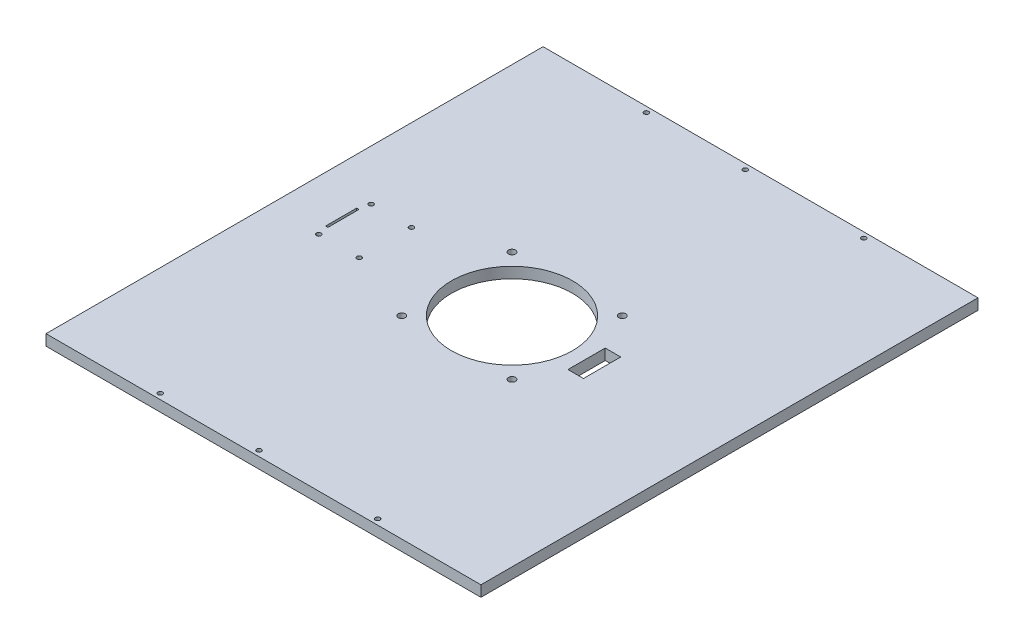
ISO-10303-21;
HEADER;
FILE_DESCRIPTION(('STEP AP214'),'2;1');
FILE_NAME('part.step','',(''),(''),'','','');
FILE_SCHEMA(('AUTOMOTIVE_DESIGN { 1 0 10303 214 1 1 1 1 }'));
ENDSEC;
DATA;
#1=APPLICATION_CONTEXT('core data for automotive mechanical design processes');
#2=APPLICATION_PROTOCOL_DEFINITION('international standard','automotive_design',2000,#1);
#3=PRODUCT_CONTEXT('',#1,'mechanical');
#4=PRODUCT('Part','Part','',(#3));
#5=PRODUCT_RELATED_PRODUCT_CATEGORY('part','',(#4));
#6=PRODUCT_DEFINITION_FORMATION('','',#4);
#7=PRODUCT_DEFINITION_CONTEXT('part definition',#1,'design');
#8=PRODUCT_DEFINITION('design','',#6,#7);
#9=PRODUCT_DEFINITION_SHAPE('','',#8);
#10=(LENGTH_UNIT() NAMED_UNIT(*) SI_UNIT(.MILLI.,.METRE.));
#11=(NAMED_UNIT(*) PLANE_ANGLE_UNIT() SI_UNIT($,.RADIAN.));
#12=(NAMED_UNIT(*) SI_UNIT($,.STERADIAN.) SOLID_ANGLE_UNIT());
#13=UNCERTAINTY_MEASURE_WITH_UNIT(LENGTH_MEASURE(1.E-05),#10,'distance_accuracy_value','');
#14=(GEOMETRIC_REPRESENTATION_CONTEXT(3) GLOBAL_UNCERTAINTY_ASSIGNED_CONTEXT((#13)) GLOBAL_UNIT_ASSIGNED_CONTEXT((#10,
#11,#12)) REPRESENTATION_CONTEXT('',''));
#15=CARTESIAN_POINT('',(0.,0.,0.));
#16=DIRECTION('',(0.,0.,1.));
#17=DIRECTION('',(1.,0.,0.));
#18=AXIS2_PLACEMENT_3D('',#15,#16,#17);
#19=CARTESIAN_POINT('',(0.,7.,160.));
#20=DIRECTION('',(0.,0.,-1.));
#21=DIRECTION('',(-1.,0.,0.));
#22=AXIS2_PLACEMENT_3D('',#19,#20,#21);
#23=PLANE('',#22);
#24=DIRECTION('',(1.,0.,0.));
#25=VECTOR('',#24,1.);
#26=CARTESIAN_POINT('',(0.,0.,160.));
#27=LINE('',#26,#25);
#28=CARTESIAN_POINT('',(-140.,0.,160.));
#29=VERTEX_POINT('',#28);
#30=CARTESIAN_POINT('',(140.,0.,160.));
#31=VERTEX_POINT('',#30);
#32=EDGE_CURVE('E228',#29,#31,#27,.T.);
#33=ORIENTED_EDGE('',*,*,#32,.T.);
#34=DIRECTION('',(0.,-1.,0.));
#35=VECTOR('',#34,1.);
#36=CARTESIAN_POINT('',(140.,7.,160.));
#37=LINE('',#36,#35);
#38=CARTESIAN_POINT('',(140.,7.,160.));
#39=VERTEX_POINT('',#38);
#40=EDGE_CURVE('E259',#39,#31,#37,.T.);
#41=ORIENTED_EDGE('',*,*,#40,.F.);
#42=DIRECTION('',(1.,0.,0.));
#43=VECTOR('',#42,1.);
#44=CARTESIAN_POINT('',(0.,7.,160.));
#45=LINE('',#44,#43);
#46=CARTESIAN_POINT('',(-140.,7.,160.));
#47=VERTEX_POINT('',#46);
#48=EDGE_CURVE('E197',#47,#39,#45,.T.);
#49=ORIENTED_EDGE('',*,*,#48,.F.);
#50=DIRECTION('',(0.,-1.,0.));
#51=VECTOR('',#50,1.);
#52=CARTESIAN_POINT('',(-140.,7.,160.));
#53=LINE('',#52,#51);
#54=EDGE_CURVE('E224',#47,#29,#53,.T.);
#55=ORIENTED_EDGE('',*,*,#54,.T.);
#56=EDGE_LOOP('',(#33,#41,#49,#55));
#57=FACE_BOUND('',#56,.T.);
#58=ADVANCED_FACE('F36',(#57),#23,.F.);
#59=CARTESIAN_POINT('',(140.,7.,0.));
#60=DIRECTION('',(-1.,0.,0.));
#61=DIRECTION('',(0.,0.,1.));
#62=AXIS2_PLACEMENT_3D('',#59,#60,#61);
#63=PLANE('',#62);
#64=DIRECTION('',(0.,0.,-1.));
#65=VECTOR('',#64,1.);
#66=CARTESIAN_POINT('',(140.,0.,0.));
#67=LINE('',#66,#65);
#68=CARTESIAN_POINT('',(140.,0.,-160.));
#69=VERTEX_POINT('',#68);
#70=EDGE_CURVE('E231',#31,#69,#67,.T.);
#71=ORIENTED_EDGE('',*,*,#70,.T.);
#72=DIRECTION('',(0.,-1.,0.));
#73=VECTOR('',#72,1.);
#74=CARTESIAN_POINT('',(140.,7.,-160.));
#75=LINE('',#74,#73);
#76=CARTESIAN_POINT('',(140.,7.,-160.));
#77=VERTEX_POINT('',#76);
#78=EDGE_CURVE('E257',#77,#69,#75,.T.);
#79=ORIENTED_EDGE('',*,*,#78,.F.);
#80=DIRECTION('',(0.,0.,-1.));
#81=VECTOR('',#80,1.);
#82=CARTESIAN_POINT('',(140.,7.,0.));
#83=LINE('',#82,#81);
#84=EDGE_CURVE('E201',#39,#77,#83,.T.);
#85=ORIENTED_EDGE('',*,*,#84,.F.);
#86=ORIENTED_EDGE('',*,*,#40,.T.);
#87=EDGE_LOOP('',(#71,#79,#85,#86));
#88=FACE_BOUND('',#87,.T.);
#89=ADVANCED_FACE('F322',(#88),#63,.F.);
#90=CARTESIAN_POINT('',(0.,7.,-160.));
#91=DIRECTION('',(0.,0.,-1.));
#92=DIRECTION('',(-1.,0.,0.));
#93=AXIS2_PLACEMENT_3D('',#90,#91,#92);
#94=PLANE('',#93);
#95=DIRECTION('',(1.,0.,0.));
#96=VECTOR('',#95,1.);
#97=CARTESIAN_POINT('',(0.,0.,-160.));
#98=LINE('',#97,#96);
#99=CARTESIAN_POINT('',(-140.,0.,-160.));
#100=VERTEX_POINT('',#99);
#101=EDGE_CURVE('E234',#100,#69,#98,.T.);
#102=ORIENTED_EDGE('',*,*,#101,.F.);
#103=DIRECTION('',(0.,-1.,0.));
#104=VECTOR('',#103,1.);
#105=CARTESIAN_POINT('',(-140.,7.,-160.));
#106=LINE('',#105,#104);
#107=CARTESIAN_POINT('',(-140.,7.,-160.));
#108=VERTEX_POINT('',#107);
#109=EDGE_CURVE('E255',#108,#100,#106,.T.);
#110=ORIENTED_EDGE('',*,*,#109,.F.);
#111=DIRECTION('',(1.,0.,0.));
#112=VECTOR('',#111,1.);
#113=CARTESIAN_POINT('',(0.,7.,-160.));
#114=LINE('',#113,#112);
#115=EDGE_CURVE('E203',#108,#77,#114,.T.);
#116=ORIENTED_EDGE('',*,*,#115,.T.);
#117=ORIENTED_EDGE('',*,*,#78,.T.);
#118=EDGE_LOOP('',(#102,#110,#116,#117));
#119=FACE_BOUND('',#118,.T.);
#120=ADVANCED_FACE('F327',(#119),#94,.T.);
#121=CARTESIAN_POINT('',(70.,7.,156.5));
#122=DIRECTION('',(0.,-1.,0.));
#123=DIRECTION('',(0.,0.,-1.));
#124=AXIS2_PLACEMENT_3D('',#121,#122,#123);
#125=CYLINDRICAL_SURFACE('',#124,1.5);
#126=CARTESIAN_POINT('',(70.,7.,156.5));
#127=DIRECTION('',(0.,1.,0.));
#128=DIRECTION('',(0.,0.,1.));
#129=AXIS2_PLACEMENT_3D('',#126,#127,#128);
#130=CIRCLE('',#129,1.5);
#131=CARTESIAN_POINT('',(70.,7.,158.));
#132=VERTEX_POINT('',#131);
#133=EDGE_CURVE('E218',#132,#132,#130,.F.);
#134=ORIENTED_EDGE('',*,*,#133,.F.);
#135=EDGE_LOOP('',(#134));
#136=FACE_BOUND('',#135,.T.);
#137=CARTESIAN_POINT('',(70.,0.,156.5));
#138=DIRECTION('',(0.,1.,0.));
#139=DIRECTION('',(0.,0.,1.));
#140=AXIS2_PLACEMENT_3D('',#137,#138,#139);
#141=CIRCLE('',#140,1.5);
#142=CARTESIAN_POINT('',(70.,0.,158.));
#143=VERTEX_POINT('',#142);
#144=EDGE_CURVE('E249',#143,#143,#141,.F.);
#145=ORIENTED_EDGE('',*,*,#144,.T.);
#146=EDGE_LOOP('',(#145));
#147=FACE_BOUND('',#146,.T.);
#148=ADVANCED_FACE('F333',(#136,#147),#125,.F.);
#149=CARTESIAN_POINT('',(70.,7.,-156.5));
#150=DIRECTION('',(0.,-1.,0.));
#151=DIRECTION('',(0.,0.,-1.));
#152=AXIS2_PLACEMENT_3D('',#149,#150,#151);
#153=CYLINDRICAL_SURFACE('',#152,1.5);
#154=CARTESIAN_POINT('',(70.,7.,-156.5));
#155=DIRECTION('',(0.,1.,0.));
#156=DIRECTION('',(0.,0.,1.));
#157=AXIS2_PLACEMENT_3D('',#154,#155,#156);
#158=CIRCLE('',#157,1.5);
#159=CARTESIAN_POINT('',(70.,7.,-155.));
#160=VERTEX_POINT('',#159);
#161=EDGE_CURVE('E215',#160,#160,#158,.T.);
#162=ORIENTED_EDGE('',*,*,#161,.T.);
#163=EDGE_LOOP('',(#162));
#164=FACE_BOUND('',#163,.T.);
#165=CARTESIAN_POINT('',(70.,0.,-156.5));
#166=DIRECTION('',(0.,1.,0.));
#167=DIRECTION('',(0.,0.,1.));
#168=AXIS2_PLACEMENT_3D('',#165,#166,#167);
#169=CIRCLE('',#168,1.5);
#170=CARTESIAN_POINT('',(70.,0.,-155.));
#171=VERTEX_POINT('',#170);
#172=EDGE_CURVE('E246',#171,#171,#169,.T.);
#173=ORIENTED_EDGE('',*,*,#172,.F.);
#174=EDGE_LOOP('',(#173));
#175=FACE_BOUND('',#174,.T.);
#176=ADVANCED_FACE('F346',(#164,#175),#153,.F.);
#177=CARTESIAN_POINT('',(-6.3766423357664,7.,-156.5));
#178=DIRECTION('',(0.,-1.,0.));
#179=DIRECTION('',(0.,0.,-1.));
#180=AXIS2_PLACEMENT_3D('',#177,#178,#179);
#181=CYLINDRICAL_SURFACE('',#180,1.5);
#182=CARTESIAN_POINT('',(-6.3766423357664,7.,-156.5));
#183=DIRECTION('',(0.,1.,0.));
#184=DIRECTION('',(0.,0.,1.));
#185=AXIS2_PLACEMENT_3D('',#182,#183,#184);
#186=CIRCLE('',#185,1.5);
#187=CARTESIAN_POINT('',(-6.3766423357664,7.,-155.));
#188=VERTEX_POINT('',#187);
#189=EDGE_CURVE('E212',#188,#188,#186,.T.);
#190=ORIENTED_EDGE('',*,*,#189,.T.);
#191=EDGE_LOOP('',(#190));
#192=FACE_BOUND('',#191,.T.);
#193=CARTESIAN_POINT('',(-6.3766423357664,0.,-156.5));
#194=DIRECTION('',(0.,1.,0.));
#195=DIRECTION('',(0.,0.,1.));
#196=AXIS2_PLACEMENT_3D('',#193,#194,#195);
#197=CIRCLE('',#196,1.5);
#198=CARTESIAN_POINT('',(-6.3766423357664,0.,-155.));
#199=VERTEX_POINT('',#198);
#200=EDGE_CURVE('E243',#199,#199,#197,.T.);
#201=ORIENTED_EDGE('',*,*,#200,.F.);
#202=EDGE_LOOP('',(#201));
#203=FACE_BOUND('',#202,.T.);
#204=ADVANCED_FACE('F342',(#192,#203),#181,.F.);
#205=CARTESIAN_POINT('',(-70.,7.,-156.5));
#206=DIRECTION('',(0.,-1.,0.));
#207=DIRECTION('',(0.,0.,-1.));
#208=AXIS2_PLACEMENT_3D('',#205,#206,#207);
#209=CYLINDRICAL_SURFACE('',#208,1.5);
#210=CARTESIAN_POINT('',(-70.,7.,-156.5));
#211=DIRECTION('',(0.,1.,0.));
#212=DIRECTION('',(0.,0.,1.));
#213=AXIS2_PLACEMENT_3D('',#210,#211,#212);
#214=CIRCLE('',#213,1.5);
#215=CARTESIAN_POINT('',(-70.,7.,-155.));
#216=VERTEX_POINT('',#215);
#217=EDGE_CURVE('E209',#216,#216,#214,.T.);
#218=ORIENTED_EDGE('',*,*,#217,.T.);
#219=EDGE_LOOP('',(#218));
#220=FACE_BOUND('',#219,.T.);
#221=CARTESIAN_POINT('',(-70.,0.,-156.5));
#222=DIRECTION('',(0.,1.,0.));
#223=DIRECTION('',(0.,0.,1.));
#224=AXIS2_PLACEMENT_3D('',#221,#222,#223);
#225=CIRCLE('',#224,1.5);
#226=CARTESIAN_POINT('',(-70.,0.,-155.));
#227=VERTEX_POINT('',#226);
#228=EDGE_CURVE('E240',#227,#227,#225,.T.);
#229=ORIENTED_EDGE('',*,*,#228,.F.);
#230=EDGE_LOOP('',(#229));
#231=FACE_BOUND('',#230,.T.);
#232=ADVANCED_FACE('F338',(#220,#231),#209,.F.);
#233=CARTESIAN_POINT('',(-140.,7.,0.));
#234=DIRECTION('',(-1.,0.,0.));
#235=DIRECTION('',(0.,0.,1.));
#236=AXIS2_PLACEMENT_3D('',#233,#234,#235);
#237=PLANE('',#236);
#238=DIRECTION('',(0.,0.,-1.));
#239=VECTOR('',#238,1.);
#240=CARTESIAN_POINT('',(-140.,0.,0.));
#241=LINE('',#240,#239);
#242=EDGE_CURVE('E237',#29,#100,#241,.T.);
#243=ORIENTED_EDGE('',*,*,#242,.F.);
#244=ORIENTED_EDGE('',*,*,#54,.F.);
#245=DIRECTION('',(0.,0.,-1.));
#246=VECTOR('',#245,1.);
#247=CARTESIAN_POINT('',(-140.,7.,0.));
#248=LINE('',#247,#246);
#249=EDGE_CURVE('E206',#47,#108,#248,.T.);
#250=ORIENTED_EDGE('',*,*,#249,.T.);
#251=ORIENTED_EDGE('',*,*,#109,.T.);
#252=EDGE_LOOP('',(#243,#244,#250,#251));
#253=FACE_BOUND('',#252,.T.);
#254=ADVANCED_FACE('F335',(#253),#237,.T.);
#255=CARTESIAN_POINT('',(-6.3766423357664,7.,156.5));
#256=DIRECTION('',(0.,-1.,0.));
#257=DIRECTION('',(0.,0.,-1.));
#258=AXIS2_PLACEMENT_3D('',#255,#256,#257);
#259=CYLINDRICAL_SURFACE('',#258,1.5);
#260=CARTESIAN_POINT('',(-6.3766423357664,7.,156.5));
#261=DIRECTION('',(0.,1.,0.));
#262=DIRECTION('',(0.,0.,1.));
#263=AXIS2_PLACEMENT_3D('',#260,#261,#262);
#264=CIRCLE('',#263,1.5);
#265=CARTESIAN_POINT('',(-6.3766423357664,7.,158.));
#266=VERTEX_POINT('',#265);
#267=EDGE_CURVE('E194',#266,#266,#264,.F.);
#268=ORIENTED_EDGE('',*,*,#267,.F.);
#269=EDGE_LOOP('',(#268));
#270=FACE_BOUND('',#269,.T.);
#271=CARTESIAN_POINT('',(-6.3766423357664,0.,156.5));
#272=DIRECTION('',(0.,1.,0.));
#273=DIRECTION('',(0.,0.,1.));
#274=AXIS2_PLACEMENT_3D('',#271,#272,#273);
#275=CIRCLE('',#274,1.5);
#276=CARTESIAN_POINT('',(-6.3766423357664,0.,158.));
#277=VERTEX_POINT('',#276);
#278=EDGE_CURVE('E225',#277,#277,#275,.F.);
#279=ORIENTED_EDGE('',*,*,#278,.T.);
#280=EDGE_LOOP('',(#279));
#281=FACE_BOUND('',#280,.T.);
#282=ADVANCED_FACE('F38',(#270,#281),#259,.F.);
#283=CARTESIAN_POINT('',(-70.,7.,156.5));
#284=DIRECTION('',(0.,-1.,0.));
#285=DIRECTION('',(0.,0.,-1.));
#286=AXIS2_PLACEMENT_3D('',#283,#284,#285);
#287=CYLINDRICAL_SURFACE('',#286,1.5);
#288=CARTESIAN_POINT('',(-70.,7.,156.5));
#289=DIRECTION('',(0.,1.,0.));
#290=DIRECTION('',(0.,0.,1.));
#291=AXIS2_PLACEMENT_3D('',#288,#289,#290);
#292=CIRCLE('',#291,1.5);
#293=CARTESIAN_POINT('',(-70.,7.,158.));
#294=VERTEX_POINT('',#293);
#295=EDGE_CURVE('E221',#294,#294,#292,.F.);
#296=ORIENTED_EDGE('',*,*,#295,.F.);
#297=EDGE_LOOP('',(#296));
#298=FACE_BOUND('',#297,.T.);
#299=CARTESIAN_POINT('',(-70.,0.,156.5));
#300=DIRECTION('',(0.,1.,0.));
#301=DIRECTION('',(0.,0.,1.));
#302=AXIS2_PLACEMENT_3D('',#299,#300,#301);
#303=CIRCLE('',#302,1.5);
#304=CARTESIAN_POINT('',(-70.,0.,158.));
#305=VERTEX_POINT('',#304);
#306=EDGE_CURVE('E198',#305,#305,#303,.F.);
#307=ORIENTED_EDGE('',*,*,#306,.T.);
#308=EDGE_LOOP('',(#307));
#309=FACE_BOUND('',#308,.T.);
#310=ADVANCED_FACE('F354',(#298,#309),#287,.F.);
#311=CARTESIAN_POINT('',(0.,7.,0.));
#312=DIRECTION('',(0.,1.,0.));
#313=DIRECTION('',(0.,0.,1.));
#314=AXIS2_PLACEMENT_3D('',#311,#312,#313);
#315=PLANE('',#314);
#316=CARTESIAN_POINT('',(-81.564347937686,7.,-16.8337461947073));
#317=DIRECTION('',(0.,1.,0.));
#318=DIRECTION('',(0.,0.,-1.));
#319=AXIS2_PLACEMENT_3D('',#316,#317,#318);
#320=CIRCLE('',#319,1.5);
#321=CARTESIAN_POINT('',(-81.564347937686,7.,-18.3337461947073));
#322=VERTEX_POINT('',#321);
#323=EDGE_CURVE('E160',#322,#322,#320,.T.);
#324=ORIENTED_EDGE('',*,*,#323,.F.);
#325=EDGE_LOOP('',(#324));
#326=FACE_BOUND('',#325,.T.);
#327=CARTESIAN_POINT('',(-107.555652062314,7.,-16.8337461947073));
#328=DIRECTION('',(0.,1.,0.));
#329=DIRECTION('',(0.,0.,1.));
#330=AXIS2_PLACEMENT_3D('',#327,#328,#329);
#331=CIRCLE('',#330,1.5);
#332=CARTESIAN_POINT('',(-107.555652062314,7.,-15.3337461947073));
#333=VERTEX_POINT('',#332);
#334=EDGE_CURVE('E133',#333,#333,#331,.T.);
#335=ORIENTED_EDGE('',*,*,#334,.F.);
#336=EDGE_LOOP('',(#335));
#337=FACE_BOUND('',#336,.T.);
#338=DIRECTION('',(0.,0.,1.));
#339=VECTOR('',#338,1.);
#340=CARTESIAN_POINT('',(-110.,7.,-10.));
#341=LINE('',#340,#339);
#342=CARTESIAN_POINT('',(-110.,7.,-10.));
#343=VERTEX_POINT('',#342);
#344=CARTESIAN_POINT('',(-110.,7.,10.));
#345=VERTEX_POINT('',#344);
#346=EDGE_CURVE('E53',#343,#345,#341,.T.);
#347=ORIENTED_EDGE('',*,*,#346,.F.);
#348=DIRECTION('',(-1.,0.,0.));
#349=VECTOR('',#348,1.);
#350=CARTESIAN_POINT('',(-110.,7.,-10.));
#351=LINE('',#350,#349);
#352=CARTESIAN_POINT('',(-108.5,7.,-10.));
#353=VERTEX_POINT('',#352);
#354=EDGE_CURVE('E136',#353,#343,#351,.T.);
#355=ORIENTED_EDGE('',*,*,#354,.F.);
#356=DIRECTION('',(0.,0.,-1.));
#357=VECTOR('',#356,1.);
#358=CARTESIAN_POINT('',(-108.5,7.,-10.));
#359=LINE('',#358,#357);
#360=CARTESIAN_POINT('',(-108.5,7.,10.));
#361=VERTEX_POINT('',#360);
#362=EDGE_CURVE('E142',#361,#353,#359,.T.);
#363=ORIENTED_EDGE('',*,*,#362,.F.);
#364=DIRECTION('',(1.,0.,0.));
#365=VECTOR('',#364,1.);
#366=CARTESIAN_POINT('',(-110.,7.,10.));
#367=LINE('',#366,#365);
#368=EDGE_CURVE('E149',#345,#361,#367,.T.);
#369=ORIENTED_EDGE('',*,*,#368,.F.);
#370=EDGE_LOOP('',(#347,#355,#363,#369));
#371=FACE_BOUND('',#370,.T.);
#372=CARTESIAN_POINT('',(-35.5000000000004,7.,35.4999999999996));
#373=DIRECTION('',(0.,1.,0.));
#374=DIRECTION('',(0.,0.,1.));
#375=AXIS2_PLACEMENT_3D('',#372,#373,#374);
#376=CIRCLE('',#375,2.24999999999999);
#377=CARTESIAN_POINT('',(-35.5000000000004,7.,37.7499999999996));
#378=VERTEX_POINT('',#377);
#379=EDGE_CURVE('E150',#378,#378,#376,.T.);
#380=ORIENTED_EDGE('',*,*,#379,.F.);
#381=EDGE_LOOP('',(#380));
#382=FACE_BOUND('',#381,.T.);
#383=CARTESIAN_POINT('',(-35.5,7.,-35.5));
#384=DIRECTION('',(0.,1.,0.));
#385=DIRECTION('',(0.,0.,1.));
#386=AXIS2_PLACEMENT_3D('',#383,#384,#385);
#387=CIRCLE('',#386,2.25);
#388=CARTESIAN_POINT('',(-35.5,7.,-33.25));
#389=VERTEX_POINT('',#388);
#390=EDGE_CURVE('E170',#389,#389,#387,.T.);
#391=ORIENTED_EDGE('',*,*,#390,.F.);
#392=EDGE_LOOP('',(#391));
#393=FACE_BOUND('',#392,.T.);
#394=DIRECTION('',(0.,0.,-1.));
#395=VECTOR('',#394,1.);
#396=CARTESIAN_POINT('',(58.,7.,12.));
#397=LINE('',#396,#395);
#398=CARTESIAN_POINT('',(58.,7.,12.));
#399=VERTEX_POINT('',#398);
#400=CARTESIAN_POINT('',(58.,7.,-12.));
#401=VERTEX_POINT('',#400);
#402=EDGE_CURVE('E61',#399,#401,#397,.T.);
#403=ORIENTED_EDGE('',*,*,#402,.F.);
#404=DIRECTION('',(1.,0.,0.));
#405=VECTOR('',#404,1.);
#406=CARTESIAN_POINT('',(48.,7.,12.));
#407=LINE('',#406,#405);
#408=CARTESIAN_POINT('',(48.,7.,12.));
#409=VERTEX_POINT('',#408);
#410=EDGE_CURVE('E176',#409,#399,#407,.T.);
#411=ORIENTED_EDGE('',*,*,#410,.F.);
#412=DIRECTION('',(0.,0.,1.));
#413=VECTOR('',#412,1.);
#414=CARTESIAN_POINT('',(48.,7.,12.));
#415=LINE('',#414,#413);
#416=CARTESIAN_POINT('',(48.,7.,-12.));
#417=VERTEX_POINT('',#416);
#418=EDGE_CURVE('E184',#417,#409,#415,.T.);
#419=ORIENTED_EDGE('',*,*,#418,.F.);
#420=DIRECTION('',(-1.,0.,0.));
#421=VECTOR('',#420,1.);
#422=CARTESIAN_POINT('',(48.,7.,-12.));
#423=LINE('',#422,#421);
#424=EDGE_CURVE('E187',#401,#417,#423,.T.);
#425=ORIENTED_EDGE('',*,*,#424,.F.);
#426=EDGE_LOOP('',(#403,#411,#419,#425));
#427=FACE_BOUND('',#426,.T.);
#428=CARTESIAN_POINT('',(35.5000000000001,7.,-35.4999999999999));
#429=DIRECTION('',(0.,1.,0.));
#430=DIRECTION('',(0.,0.,1.));
#431=AXIS2_PLACEMENT_3D('',#428,#429,#430);
#432=CIRCLE('',#431,2.24999999999999);
#433=CARTESIAN_POINT('',(35.5000000000001,7.,-33.2499999999999));
#434=VERTEX_POINT('',#433);
#435=EDGE_CURVE('E164',#434,#434,#432,.T.);
#436=ORIENTED_EDGE('',*,*,#435,.F.);
#437=EDGE_LOOP('',(#436));
#438=FACE_BOUND('',#437,.T.);
#439=CARTESIAN_POINT('',(35.4999999999997,7.,35.5000000000002));
#440=DIRECTION('',(0.,1.,0.));
#441=DIRECTION('',(0.,0.,1.));
#442=AXIS2_PLACEMENT_3D('',#439,#440,#441);
#443=CIRCLE('',#442,2.24999999999999);
#444=CARTESIAN_POINT('',(35.4999999999997,7.,37.7500000000002));
#445=VERTEX_POINT('',#444);
#446=EDGE_CURVE('E153',#445,#445,#443,.T.);
#447=ORIENTED_EDGE('',*,*,#446,.F.);
#448=EDGE_LOOP('',(#447));
#449=FACE_BOUND('',#448,.T.);
#450=CARTESIAN_POINT('',(-107.555652062314,7.,16.8337461947073));
#451=DIRECTION('',(0.,1.,0.));
#452=DIRECTION('',(0.,0.,-1.));
#453=AXIS2_PLACEMENT_3D('',#450,#451,#452);
#454=CIRCLE('',#453,1.5);
#455=CARTESIAN_POINT('',(-107.555652062314,7.,15.3337461947073));
#456=VERTEX_POINT('',#455);
#457=EDGE_CURVE('E163',#456,#456,#454,.T.);
#458=ORIENTED_EDGE('',*,*,#457,.F.);
#459=EDGE_LOOP('',(#458));
#460=FACE_BOUND('',#459,.T.);
#461=CARTESIAN_POINT('',(-81.564347937686,7.,16.8337461947073));
#462=DIRECTION('',(0.,1.,0.));
#463=DIRECTION('',(0.,0.,1.));
#464=AXIS2_PLACEMENT_3D('',#461,#462,#463);
#465=CIRCLE('',#464,1.5);
#466=CARTESIAN_POINT('',(-81.564347937686,7.,18.3337461947073));
#467=VERTEX_POINT('',#466);
#468=EDGE_CURVE('E732',#467,#467,#465,.T.);
#469=ORIENTED_EDGE('',*,*,#468,.F.);
#470=EDGE_LOOP('',(#469));
#471=FACE_BOUND('',#470,.T.);
#472=CARTESIAN_POINT('',(0.,7.,0.));
#473=DIRECTION('',(0.,1.,0.));
#474=DIRECTION('',(0.,0.,1.));
#475=AXIS2_PLACEMENT_3D('',#472,#473,#474);
#476=CIRCLE('',#475,39.);
#477=CARTESIAN_POINT('',(0.,7.,39.));
#478=VERTEX_POINT('',#477);
#479=EDGE_CURVE('E173',#478,#478,#476,.T.);
#480=ORIENTED_EDGE('',*,*,#479,.F.);
#481=EDGE_LOOP('',(#480));
#482=FACE_BOUND('',#481,.T.);
#483=ORIENTED_EDGE('',*,*,#267,.T.);
#484=EDGE_LOOP('',(#483));
#485=FACE_BOUND('',#484,.T.);
#486=ORIENTED_EDGE('',*,*,#48,.T.);
#487=ORIENTED_EDGE('',*,*,#84,.T.);
#488=ORIENTED_EDGE('',*,*,#115,.F.);
#489=ORIENTED_EDGE('',*,*,#249,.F.);
#490=EDGE_LOOP('',(#486,#487,#488,#489));
#491=FACE_BOUND('',#490,.T.);
#492=ORIENTED_EDGE('',*,*,#217,.F.);
#493=EDGE_LOOP('',(#492));
#494=FACE_BOUND('',#493,.T.);
#495=ORIENTED_EDGE('',*,*,#189,.F.);
#496=EDGE_LOOP('',(#495));
#497=FACE_BOUND('',#496,.T.);
#498=ORIENTED_EDGE('',*,*,#161,.F.);
#499=EDGE_LOOP('',(#498));
#500=FACE_BOUND('',#499,.T.);
#501=ORIENTED_EDGE('',*,*,#133,.T.);
#502=EDGE_LOOP('',(#501));
#503=FACE_BOUND('',#502,.T.);
#504=ORIENTED_EDGE('',*,*,#295,.T.);
#505=EDGE_LOOP('',(#504));
#506=FACE_BOUND('',#505,.T.);
#507=ADVANCED_FACE('F146',(#326,#337,#371,#382,#393,#427,#438,#449,#460,#471,#482,#485,#491,
#494,#497,#500,#503,#506),#315,.T.);
#508=CARTESIAN_POINT('',(0.,0.,0.));
#509=DIRECTION('',(0.,1.,0.));
#510=DIRECTION('',(0.,0.,1.));
#511=AXIS2_PLACEMENT_3D('',#508,#509,#510);
#512=PLANE('',#511);
#513=CARTESIAN_POINT('',(-81.564347937686,0.,-16.8337461947073));
#514=DIRECTION('',(0.,1.,0.));
#515=DIRECTION('',(0.,0.,1.));
#516=AXIS2_PLACEMENT_3D('',#513,#514,#515);
#517=CIRCLE('',#516,1.5);
#518=CARTESIAN_POINT('',(-81.564347937686,0.,-15.3337461947073));
#519=VERTEX_POINT('',#518);
#520=EDGE_CURVE('E40',#519,#519,#517,.T.);
#521=ORIENTED_EDGE('',*,*,#520,.T.);
#522=EDGE_LOOP('',(#521));
#523=FACE_BOUND('',#522,.T.);
#524=CARTESIAN_POINT('',(-107.555652062314,0.,-16.8337461947073));
#525=DIRECTION('',(0.,1.,0.));
#526=DIRECTION('',(0.,0.,1.));
#527=AXIS2_PLACEMENT_3D('',#524,#525,#526);
#528=CIRCLE('',#527,1.5);
#529=CARTESIAN_POINT('',(-107.555652062314,0.,-15.3337461947073));
#530=VERTEX_POINT('',#529);
#531=EDGE_CURVE('E295',#530,#530,#528,.T.);
#532=ORIENTED_EDGE('',*,*,#531,.T.);
#533=EDGE_LOOP('',(#532));
#534=FACE_BOUND('',#533,.T.);
#535=DIRECTION('',(-1.,0.,0.));
#536=VECTOR('',#535,1.);
#537=CARTESIAN_POINT('',(0.,0.,-10.));
#538=LINE('',#537,#536);
#539=CARTESIAN_POINT('',(-108.5,0.,-10.));
#540=VERTEX_POINT('',#539);
#541=CARTESIAN_POINT('',(-110.,0.,-10.));
#542=VERTEX_POINT('',#541);
#543=EDGE_CURVE('E45',#540,#542,#538,.T.);
#544=ORIENTED_EDGE('',*,*,#543,.T.);
#545=DIRECTION('',(0.,0.,1.));
#546=VECTOR('',#545,1.);
#547=CARTESIAN_POINT('',(-110.,0.,0.));
#548=LINE('',#547,#546);
#549=CARTESIAN_POINT('',(-110.,0.,10.));
#550=VERTEX_POINT('',#549);
#551=EDGE_CURVE('E11',#542,#550,#548,.T.);
#552=ORIENTED_EDGE('',*,*,#551,.T.);
#553=DIRECTION('',(1.,0.,0.));
#554=VECTOR('',#553,1.);
#555=CARTESIAN_POINT('',(0.,0.,10.));
#556=LINE('',#555,#554);
#557=CARTESIAN_POINT('',(-108.5,0.,10.));
#558=VERTEX_POINT('',#557);
#559=EDGE_CURVE('E289',#550,#558,#556,.T.);
#560=ORIENTED_EDGE('',*,*,#559,.T.);
#561=DIRECTION('',(0.,0.,-1.));
#562=VECTOR('',#561,1.);
#563=CARTESIAN_POINT('',(-108.5,0.,0.));
#564=LINE('',#563,#562);
#565=EDGE_CURVE('E298',#558,#540,#564,.T.);
#566=ORIENTED_EDGE('',*,*,#565,.T.);
#567=EDGE_LOOP('',(#544,#552,#560,#566));
#568=FACE_BOUND('',#567,.T.);
#569=CARTESIAN_POINT('',(-35.5000000000004,0.,35.4999999999996));
#570=DIRECTION('',(0.,1.,0.));
#571=DIRECTION('',(0.,0.,1.));
#572=AXIS2_PLACEMENT_3D('',#569,#570,#571);
#573=CIRCLE('',#572,2.24999999999999);
#574=CARTESIAN_POINT('',(-35.5000000000004,0.,37.7499999999996));
#575=VERTEX_POINT('',#574);
#576=EDGE_CURVE('E292',#575,#575,#573,.T.);
#577=ORIENTED_EDGE('',*,*,#576,.T.);
#578=EDGE_LOOP('',(#577));
#579=FACE_BOUND('',#578,.T.);
#580=CARTESIAN_POINT('',(-35.5,0.,-35.5));
#581=DIRECTION('',(0.,1.,0.));
#582=DIRECTION('',(0.,0.,1.));
#583=AXIS2_PLACEMENT_3D('',#580,#581,#582);
#584=CIRCLE('',#583,2.25);
#585=CARTESIAN_POINT('',(-35.5,0.,-33.25));
#586=VERTEX_POINT('',#585);
#587=EDGE_CURVE('E277',#586,#586,#584,.T.);
#588=ORIENTED_EDGE('',*,*,#587,.T.);
#589=EDGE_LOOP('',(#588));
#590=FACE_BOUND('',#589,.T.);
#591=DIRECTION('',(1.,0.,0.));
#592=VECTOR('',#591,1.);
#593=CARTESIAN_POINT('',(0.,0.,12.));
#594=LINE('',#593,#592);
#595=CARTESIAN_POINT('',(48.,0.,12.));
#596=VERTEX_POINT('',#595);
#597=CARTESIAN_POINT('',(58.,0.,12.));
#598=VERTEX_POINT('',#597);
#599=EDGE_CURVE('E283',#596,#598,#594,.T.);
#600=ORIENTED_EDGE('',*,*,#599,.T.);
#601=DIRECTION('',(0.,0.,-1.));
#602=VECTOR('',#601,1.);
#603=CARTESIAN_POINT('',(58.,0.,0.));
#604=LINE('',#603,#602);
#605=CARTESIAN_POINT('',(58.,0.,-12.));
#606=VERTEX_POINT('',#605);
#607=EDGE_CURVE('E286',#598,#606,#604,.T.);
#608=ORIENTED_EDGE('',*,*,#607,.T.);
#609=DIRECTION('',(-1.,0.,0.));
#610=VECTOR('',#609,1.);
#611=CARTESIAN_POINT('',(0.,0.,-12.));
#612=LINE('',#611,#610);
#613=CARTESIAN_POINT('',(48.,0.,-12.));
#614=VERTEX_POINT('',#613);
#615=EDGE_CURVE('E262',#606,#614,#612,.T.);
#616=ORIENTED_EDGE('',*,*,#615,.T.);
#617=DIRECTION('',(0.,0.,1.));
#618=VECTOR('',#617,1.);
#619=CARTESIAN_POINT('',(48.,0.,0.));
#620=LINE('',#619,#618);
#621=EDGE_CURVE('E280',#614,#596,#620,.T.);
#622=ORIENTED_EDGE('',*,*,#621,.T.);
#623=EDGE_LOOP('',(#600,#608,#616,#622));
#624=FACE_BOUND('',#623,.T.);
#625=CARTESIAN_POINT('',(35.5000000000001,0.,-35.4999999999999));
#626=DIRECTION('',(0.,1.,0.));
#627=DIRECTION('',(0.,0.,1.));
#628=AXIS2_PLACEMENT_3D('',#625,#626,#627);
#629=CIRCLE('',#628,2.24999999999999);
#630=CARTESIAN_POINT('',(35.5000000000001,0.,-33.2499999999999));
#631=VERTEX_POINT('',#630);
#632=EDGE_CURVE('E274',#631,#631,#629,.T.);
#633=ORIENTED_EDGE('',*,*,#632,.T.);
#634=EDGE_LOOP('',(#633));
#635=FACE_BOUND('',#634,.T.);
#636=CARTESIAN_POINT('',(35.4999999999997,0.,35.5000000000002));
#637=DIRECTION('',(0.,1.,0.));
#638=DIRECTION('',(0.,0.,1.));
#639=AXIS2_PLACEMENT_3D('',#636,#637,#638);
#640=CIRCLE('',#639,2.24999999999999);
#641=CARTESIAN_POINT('',(35.4999999999997,0.,37.7500000000002));
#642=VERTEX_POINT('',#641);
#643=EDGE_CURVE('E271',#642,#642,#640,.T.);
#644=ORIENTED_EDGE('',*,*,#643,.T.);
#645=EDGE_LOOP('',(#644));
#646=FACE_BOUND('',#645,.T.);
#647=CARTESIAN_POINT('',(-107.555652062314,0.,16.8337461947073));
#648=DIRECTION('',(0.,1.,0.));
#649=DIRECTION('',(0.,0.,1.));
#650=AXIS2_PLACEMENT_3D('',#647,#648,#649);
#651=CIRCLE('',#650,1.5);
#652=CARTESIAN_POINT('',(-107.555652062314,0.,18.3337461947073));
#653=VERTEX_POINT('',#652);
#654=EDGE_CURVE('E268',#653,#653,#651,.T.);
#655=ORIENTED_EDGE('',*,*,#654,.T.);
#656=EDGE_LOOP('',(#655));
#657=FACE_BOUND('',#656,.T.);
#658=CARTESIAN_POINT('',(-81.564347937686,0.,16.8337461947073));
#659=DIRECTION('',(0.,1.,0.));
#660=DIRECTION('',(0.,0.,1.));
#661=AXIS2_PLACEMENT_3D('',#658,#659,#660);
#662=CIRCLE('',#661,1.5);
#663=CARTESIAN_POINT('',(-81.564347937686,0.,18.3337461947073));
#664=VERTEX_POINT('',#663);
#665=EDGE_CURVE('E265',#664,#664,#662,.T.);
#666=ORIENTED_EDGE('',*,*,#665,.T.);
#667=EDGE_LOOP('',(#666));
#668=FACE_BOUND('',#667,.T.);
#669=CARTESIAN_POINT('',(0.,0.,0.));
#670=DIRECTION('',(0.,1.,0.));
#671=DIRECTION('',(0.,0.,1.));
#672=AXIS2_PLACEMENT_3D('',#669,#670,#671);
#673=CIRCLE('',#672,39.);
#674=CARTESIAN_POINT('',(0.,0.,39.));
#675=VERTEX_POINT('',#674);
#676=EDGE_CURVE('E193',#675,#675,#673,.T.);
#677=ORIENTED_EDGE('',*,*,#676,.T.);
#678=EDGE_LOOP('',(#677));
#679=FACE_BOUND('',#678,.T.);
#680=ORIENTED_EDGE('',*,*,#278,.F.);
#681=EDGE_LOOP('',(#680));
#682=FACE_BOUND('',#681,.T.);
#683=ORIENTED_EDGE('',*,*,#32,.F.);
#684=ORIENTED_EDGE('',*,*,#242,.T.);
#685=ORIENTED_EDGE('',*,*,#101,.T.);
#686=ORIENTED_EDGE('',*,*,#70,.F.);
#687=EDGE_LOOP('',(#683,#684,#685,#686));
#688=FACE_BOUND('',#687,.T.);
#689=ORIENTED_EDGE('',*,*,#228,.T.);
#690=EDGE_LOOP('',(#689));
#691=FACE_BOUND('',#690,.T.);
#692=ORIENTED_EDGE('',*,*,#200,.T.);
#693=EDGE_LOOP('',(#692));
#694=FACE_BOUND('',#693,.T.);
#695=ORIENTED_EDGE('',*,*,#172,.T.);
#696=EDGE_LOOP('',(#695));
#697=FACE_BOUND('',#696,.T.);
#698=ORIENTED_EDGE('',*,*,#144,.F.);
#699=EDGE_LOOP('',(#698));
#700=FACE_BOUND('',#699,.T.);
#701=ORIENTED_EDGE('',*,*,#306,.F.);
#702=EDGE_LOOP('',(#701));
#703=FACE_BOUND('',#702,.T.);
#704=ADVANCED_FACE('F307',(#523,#534,#568,#579,#590,#624,#635,#646,#657,#668,#679,#682,#688,
#691,#694,#697,#700,#703),#512,.F.);
#705=CARTESIAN_POINT('',(0.,-3.,0.));
#706=DIRECTION('',(0.,1.,0.));
#707=DIRECTION('',(0.,0.,1.));
#708=AXIS2_PLACEMENT_3D('',#705,#706,#707);
#709=CYLINDRICAL_SURFACE('',#708,39.);
#710=ORIENTED_EDGE('',*,*,#479,.T.);
#711=EDGE_LOOP('',(#710));
#712=FACE_BOUND('',#711,.T.);
#713=ORIENTED_EDGE('',*,*,#676,.F.);
#714=EDGE_LOOP('',(#713));
#715=FACE_BOUND('',#714,.T.);
#716=ADVANCED_FACE('F360',(#712,#715),#709,.F.);
#717=CARTESIAN_POINT('',(-81.564347937686,-3.,16.8337461947073));
#718=DIRECTION('',(0.,1.,0.));
#719=DIRECTION('',(0.,0.,1.));
#720=AXIS2_PLACEMENT_3D('',#717,#718,#719);
#721=CYLINDRICAL_SURFACE('',#720,1.5);
#722=ORIENTED_EDGE('',*,*,#468,.T.);
#723=EDGE_LOOP('',(#722));
#724=FACE_BOUND('',#723,.T.);
#725=ORIENTED_EDGE('',*,*,#665,.F.);
#726=EDGE_LOOP('',(#725));
#727=FACE_BOUND('',#726,.T.);
#728=ADVANCED_FACE('F366',(#724,#727),#721,.F.);
#729=CARTESIAN_POINT('',(-107.555652062314,-3.,16.8337461947073));
#730=DIRECTION('',(0.,1.,0.));
#731=DIRECTION('',(0.,0.,1.));
#732=AXIS2_PLACEMENT_3D('',#729,#730,#731);
#733=CYLINDRICAL_SURFACE('',#732,1.5);
#734=ORIENTED_EDGE('',*,*,#457,.T.);
#735=EDGE_LOOP('',(#734));
#736=FACE_BOUND('',#735,.T.);
#737=ORIENTED_EDGE('',*,*,#654,.F.);
#738=EDGE_LOOP('',(#737));
#739=FACE_BOUND('',#738,.T.);
#740=ADVANCED_FACE('F391',(#736,#739),#733,.F.);
#741=CARTESIAN_POINT('',(35.4999999999997,-3.,35.5000000000002));
#742=DIRECTION('',(0.,1.,0.));
#743=DIRECTION('',(0.,0.,1.));
#744=AXIS2_PLACEMENT_3D('',#741,#742,#743);
#745=CYLINDRICAL_SURFACE('',#744,2.24999999999999);
#746=ORIENTED_EDGE('',*,*,#446,.T.);
#747=EDGE_LOOP('',(#746));
#748=FACE_BOUND('',#747,.T.);
#749=ORIENTED_EDGE('',*,*,#643,.F.);
#750=EDGE_LOOP('',(#749));
#751=FACE_BOUND('',#750,.T.);
#752=ADVANCED_FACE('F389',(#748,#751),#745,.F.);
#753=CARTESIAN_POINT('',(35.5000000000001,-3.,-35.4999999999999));
#754=DIRECTION('',(0.,1.,0.));
#755=DIRECTION('',(0.,0.,1.));
#756=AXIS2_PLACEMENT_3D('',#753,#754,#755);
#757=CYLINDRICAL_SURFACE('',#756,2.24999999999999);
#758=ORIENTED_EDGE('',*,*,#435,.T.);
#759=EDGE_LOOP('',(#758));
#760=FACE_BOUND('',#759,.T.);
#761=ORIENTED_EDGE('',*,*,#632,.F.);
#762=EDGE_LOOP('',(#761));
#763=FACE_BOUND('',#762,.T.);
#764=ADVANCED_FACE('F384',(#760,#763),#757,.F.);
#765=CARTESIAN_POINT('',(58.,-3.,12.));
#766=DIRECTION('',(1.,0.,0.));
#767=DIRECTION('',(0.,0.,-1.));
#768=AXIS2_PLACEMENT_3D('',#765,#766,#767);
#769=PLANE('',#768);
#770=DIRECTION('',(0.,1.,0.));
#771=VECTOR('',#770,1.);
#772=CARTESIAN_POINT('',(58.,-3.,12.));
#773=LINE('',#772,#771);
#774=EDGE_CURVE('E167',#598,#399,#773,.T.);
#775=ORIENTED_EDGE('',*,*,#774,.T.);
#776=ORIENTED_EDGE('',*,*,#402,.T.);
#777=DIRECTION('',(0.,1.,0.));
#778=VECTOR('',#777,1.);
#779=CARTESIAN_POINT('',(58.,-3.,-12.));
#780=LINE('',#779,#778);
#781=EDGE_CURVE('E174',#606,#401,#780,.T.);
#782=ORIENTED_EDGE('',*,*,#781,.F.);
#783=ORIENTED_EDGE('',*,*,#607,.F.);
#784=EDGE_LOOP('',(#775,#776,#782,#783));
#785=FACE_BOUND('',#784,.T.);
#786=ADVANCED_FACE('F372',(#785),#769,.F.);
#787=CARTESIAN_POINT('',(48.,-3.,12.));
#788=DIRECTION('',(0.,0.,1.));
#789=DIRECTION('',(1.,0.,0.));
#790=AXIS2_PLACEMENT_3D('',#787,#788,#789);
#791=PLANE('',#790);
#792=DIRECTION('',(0.,1.,0.));
#793=VECTOR('',#792,1.);
#794=CARTESIAN_POINT('',(48.,-3.,12.));
#795=LINE('',#794,#793);
#796=EDGE_CURVE('E179',#596,#409,#795,.T.);
#797=ORIENTED_EDGE('',*,*,#796,.T.);
#798=ORIENTED_EDGE('',*,*,#410,.T.);
#799=ORIENTED_EDGE('',*,*,#774,.F.);
#800=ORIENTED_EDGE('',*,*,#599,.F.);
#801=EDGE_LOOP('',(#797,#798,#799,#800));
#802=FACE_BOUND('',#801,.T.);
#803=ADVANCED_FACE('F368',(#802),#791,.F.);
#804=CARTESIAN_POINT('',(48.,-3.,12.));
#805=DIRECTION('',(-1.,0.,0.));
#806=DIRECTION('',(0.,0.,1.));
#807=AXIS2_PLACEMENT_3D('',#804,#805,#806);
#808=PLANE('',#807);
#809=DIRECTION('',(0.,1.,0.));
#810=VECTOR('',#809,1.);
#811=CARTESIAN_POINT('',(48.,-3.,-12.));
#812=LINE('',#811,#810);
#813=EDGE_CURVE('E177',#614,#417,#812,.T.);
#814=ORIENTED_EDGE('',*,*,#813,.T.);
#815=ORIENTED_EDGE('',*,*,#418,.T.);
#816=ORIENTED_EDGE('',*,*,#796,.F.);
#817=ORIENTED_EDGE('',*,*,#621,.F.);
#818=EDGE_LOOP('',(#814,#815,#816,#817));
#819=FACE_BOUND('',#818,.T.);
#820=ADVANCED_FACE('F371',(#819),#808,.F.);
#821=CARTESIAN_POINT('',(48.,-3.,-12.));
#822=DIRECTION('',(0.,0.,-1.));
#823=DIRECTION('',(-1.,0.,0.));
#824=AXIS2_PLACEMENT_3D('',#821,#822,#823);
#825=PLANE('',#824);
#826=ORIENTED_EDGE('',*,*,#781,.T.);
#827=ORIENTED_EDGE('',*,*,#424,.T.);
#828=ORIENTED_EDGE('',*,*,#813,.F.);
#829=ORIENTED_EDGE('',*,*,#615,.F.);
#830=EDGE_LOOP('',(#826,#827,#828,#829));
#831=FACE_BOUND('',#830,.T.);
#832=ADVANCED_FACE('F376',(#831),#825,.F.);
#833=CARTESIAN_POINT('',(-35.5,-3.,-35.5));
#834=DIRECTION('',(0.,1.,0.));
#835=DIRECTION('',(0.,0.,1.));
#836=AXIS2_PLACEMENT_3D('',#833,#834,#835);
#837=CYLINDRICAL_SURFACE('',#836,2.25);
#838=ORIENTED_EDGE('',*,*,#390,.T.);
#839=EDGE_LOOP('',(#838));
#840=FACE_BOUND('',#839,.T.);
#841=ORIENTED_EDGE('',*,*,#587,.F.);
#842=EDGE_LOOP('',(#841));
#843=FACE_BOUND('',#842,.T.);
#844=ADVANCED_FACE('F380',(#840,#843),#837,.F.);
#845=CARTESIAN_POINT('',(-35.5000000000004,-3.,35.4999999999996));
#846=DIRECTION('',(0.,1.,0.));
#847=DIRECTION('',(0.,0.,1.));
#848=AXIS2_PLACEMENT_3D('',#845,#846,#847);
#849=CYLINDRICAL_SURFACE('',#848,2.24999999999999);
#850=ORIENTED_EDGE('',*,*,#379,.T.);
#851=EDGE_LOOP('',(#850));
#852=FACE_BOUND('',#851,.T.);
#853=ORIENTED_EDGE('',*,*,#576,.F.);
#854=EDGE_LOOP('',(#853));
#855=FACE_BOUND('',#854,.T.);
#856=ADVANCED_FACE('F387',(#852,#855),#849,.F.);
#857=CARTESIAN_POINT('',(-110.,-3.,-10.));
#858=DIRECTION('',(-1.,0.,0.));
#859=DIRECTION('',(0.,0.,1.));
#860=AXIS2_PLACEMENT_3D('',#857,#858,#859);
#861=PLANE('',#860);
#862=DIRECTION('',(0.,1.,0.));
#863=VECTOR('',#862,1.);
#864=CARTESIAN_POINT('',(-110.,-3.,-10.));
#865=LINE('',#864,#863);
#866=EDGE_CURVE('E127',#542,#343,#865,.T.);
#867=ORIENTED_EDGE('',*,*,#866,.T.);
#868=ORIENTED_EDGE('',*,*,#346,.T.);
#869=DIRECTION('',(0.,1.,0.));
#870=VECTOR('',#869,1.);
#871=CARTESIAN_POINT('',(-110.,-3.,10.));
#872=LINE('',#871,#870);
#873=EDGE_CURVE('E143',#550,#345,#872,.T.);
#874=ORIENTED_EDGE('',*,*,#873,.F.);
#875=ORIENTED_EDGE('',*,*,#551,.F.);
#876=EDGE_LOOP('',(#867,#868,#874,#875));
#877=FACE_BOUND('',#876,.T.);
#878=ADVANCED_FACE('F129',(#877),#861,.F.);
#879=CARTESIAN_POINT('',(-110.,-3.,-10.));
#880=DIRECTION('',(0.,0.,-1.));
#881=DIRECTION('',(-1.,0.,0.));
#882=AXIS2_PLACEMENT_3D('',#879,#880,#881);
#883=PLANE('',#882);
#884=DIRECTION('',(0.,1.,0.));
#885=VECTOR('',#884,1.);
#886=CARTESIAN_POINT('',(-108.5,-3.,-10.));
#887=LINE('',#886,#885);
#888=EDGE_CURVE('E132',#540,#353,#887,.T.);
#889=ORIENTED_EDGE('',*,*,#888,.T.);
#890=ORIENTED_EDGE('',*,*,#354,.T.);
#891=ORIENTED_EDGE('',*,*,#866,.F.);
#892=ORIENTED_EDGE('',*,*,#543,.F.);
#893=EDGE_LOOP('',(#889,#890,#891,#892));
#894=FACE_BOUND('',#893,.T.);
#895=ADVANCED_FACE('F137',(#894),#883,.F.);
#896=CARTESIAN_POINT('',(-108.5,-3.,-10.));
#897=DIRECTION('',(1.,0.,0.));
#898=DIRECTION('',(0.,0.,-1.));
#899=AXIS2_PLACEMENT_3D('',#896,#897,#898);
#900=PLANE('',#899);
#901=DIRECTION('',(0.,1.,0.));
#902=VECTOR('',#901,1.);
#903=CARTESIAN_POINT('',(-108.5,-3.,10.));
#904=LINE('',#903,#902);
#905=EDGE_CURVE('E703',#558,#361,#904,.T.);
#906=ORIENTED_EDGE('',*,*,#905,.T.);
#907=ORIENTED_EDGE('',*,*,#362,.T.);
#908=ORIENTED_EDGE('',*,*,#888,.F.);
#909=ORIENTED_EDGE('',*,*,#565,.F.);
#910=EDGE_LOOP('',(#906,#907,#908,#909));
#911=FACE_BOUND('',#910,.T.);
#912=ADVANCED_FACE('F558',(#911),#900,.F.);
#913=CARTESIAN_POINT('',(-110.,-3.,10.));
#914=DIRECTION('',(0.,0.,1.));
#915=DIRECTION('',(1.,0.,0.));
#916=AXIS2_PLACEMENT_3D('',#913,#914,#915);
#917=PLANE('',#916);
#918=ORIENTED_EDGE('',*,*,#873,.T.);
#919=ORIENTED_EDGE('',*,*,#368,.T.);
#920=ORIENTED_EDGE('',*,*,#905,.F.);
#921=ORIENTED_EDGE('',*,*,#559,.F.);
#922=EDGE_LOOP('',(#918,#919,#920,#921));
#923=FACE_BOUND('',#922,.T.);
#924=ADVANCED_FACE('F317',(#923),#917,.F.);
#925=CARTESIAN_POINT('',(-107.555652062314,-3.,-16.8337461947073));
#926=DIRECTION('',(0.,1.,0.));
#927=DIRECTION('',(0.,0.,1.));
#928=AXIS2_PLACEMENT_3D('',#925,#926,#927);
#929=CYLINDRICAL_SURFACE('',#928,1.5);
#930=ORIENTED_EDGE('',*,*,#334,.T.);
#931=EDGE_LOOP('',(#930));
#932=FACE_BOUND('',#931,.T.);
#933=ORIENTED_EDGE('',*,*,#531,.F.);
#934=EDGE_LOOP('',(#933));
#935=FACE_BOUND('',#934,.T.);
#936=ADVANCED_FACE('F311',(#932,#935),#929,.F.);
#937=CARTESIAN_POINT('',(-81.564347937686,-3.,-16.8337461947073));
#938=DIRECTION('',(0.,1.,0.));
#939=DIRECTION('',(0.,0.,1.));
#940=AXIS2_PLACEMENT_3D('',#937,#938,#939);
#941=CYLINDRICAL_SURFACE('',#940,1.5);
#942=ORIENTED_EDGE('',*,*,#323,.T.);
#943=EDGE_LOOP('',(#942));
#944=FACE_BOUND('',#943,.T.);
#945=ORIENTED_EDGE('',*,*,#520,.F.);
#946=EDGE_LOOP('',(#945));
#947=FACE_BOUND('',#946,.T.);
#948=ADVANCED_FACE('F309',(#944,#947),#941,.F.);
#949=CLOSED_SHELL('',(#58,#89,#120,#148,#176,#204,#232,#254,#282,#310,#507,#704,#716,#728,#740,
#752,#764,#786,#803,#820,#832,#844,#856,#878,#895,#912,#924,#936,#948));
#950=MANIFOLD_SOLID_BREP('B2',#949);
#951=ADVANCED_BREP_SHAPE_REPRESENTATION('',(#18,#950),#14);
#952=SHAPE_DEFINITION_REPRESENTATION(#9,#951);
ENDSEC;
END-ISO-10303-21;
